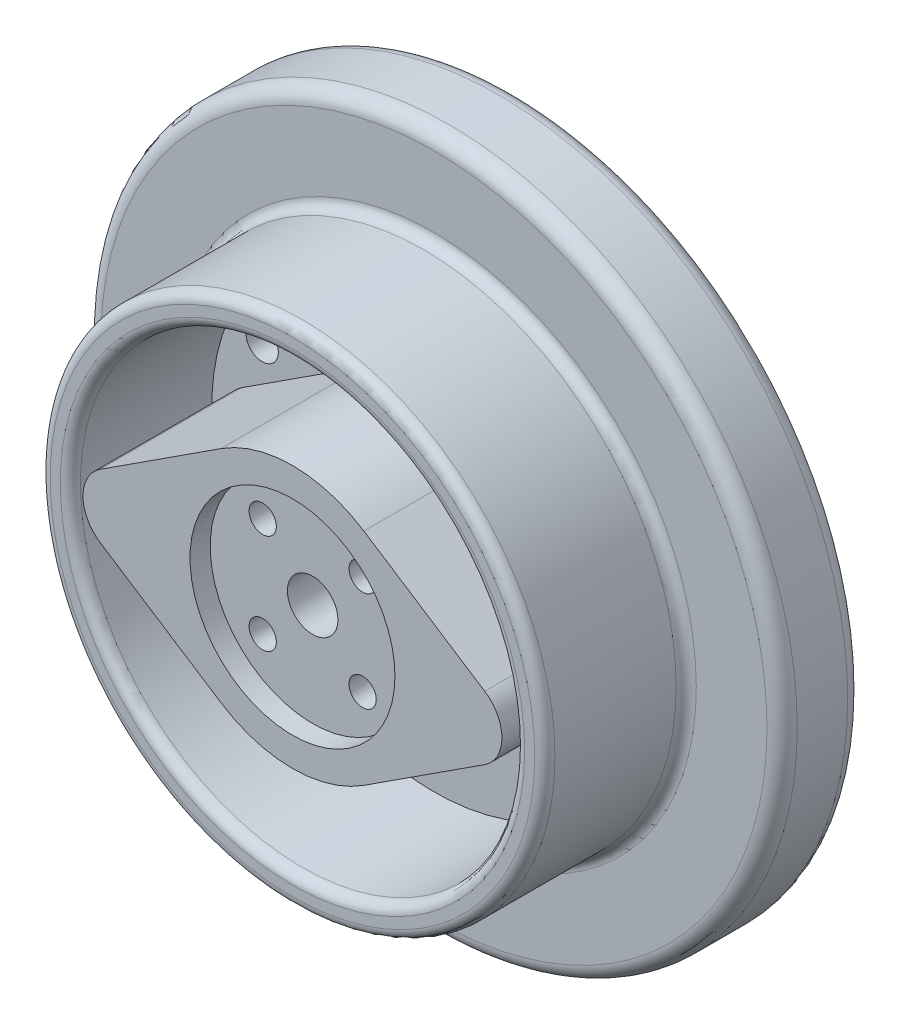
ISO-10303-21;
HEADER;
FILE_DESCRIPTION(('STEP AP214'),'2;1');
FILE_NAME('part.step','',(''),(''),'','','');
FILE_SCHEMA(('AUTOMOTIVE_DESIGN { 1 0 10303 214 1 1 1 1 }'));
ENDSEC;
DATA;
#1=APPLICATION_CONTEXT('core data for automotive mechanical design processes');
#2=APPLICATION_PROTOCOL_DEFINITION('international standard','automotive_design',2000,#1);
#3=PRODUCT_CONTEXT('',#1,'mechanical');
#4=PRODUCT('Part','Part','',(#3));
#5=PRODUCT_RELATED_PRODUCT_CATEGORY('part','',(#4));
#6=PRODUCT_DEFINITION_FORMATION('','',#4);
#7=PRODUCT_DEFINITION_CONTEXT('part definition',#1,'design');
#8=PRODUCT_DEFINITION('design','',#6,#7);
#9=PRODUCT_DEFINITION_SHAPE('','',#8);
#10=(LENGTH_UNIT() NAMED_UNIT(*) SI_UNIT(.MILLI.,.METRE.));
#11=(NAMED_UNIT(*) PLANE_ANGLE_UNIT() SI_UNIT($,.RADIAN.));
#12=(NAMED_UNIT(*) SI_UNIT($,.STERADIAN.) SOLID_ANGLE_UNIT());
#13=UNCERTAINTY_MEASURE_WITH_UNIT(LENGTH_MEASURE(1.E-05),#10,'distance_accuracy_value','');
#14=(GEOMETRIC_REPRESENTATION_CONTEXT(3) GLOBAL_UNCERTAINTY_ASSIGNED_CONTEXT((#13)) GLOBAL_UNIT_ASSIGNED_CONTEXT((#10,
#11,#12)) REPRESENTATION_CONTEXT('',''));
#15=CARTESIAN_POINT('',(0.,0.,0.));
#16=DIRECTION('',(0.,0.,1.));
#17=DIRECTION('',(1.,0.,0.));
#18=AXIS2_PLACEMENT_3D('',#15,#16,#17);
#19=CARTESIAN_POINT('',(17.,0.,0.));
#20=DIRECTION('',(0.,0.,1.));
#21=DIRECTION('',(1.,0.,0.));
#22=AXIS2_PLACEMENT_3D('',#19,#20,#21);
#23=CYLINDRICAL_SURFACE('',#22,2.55);
#24=CARTESIAN_POINT('',(17.,0.,0.));
#25=DIRECTION('',(0.,0.,1.));
#26=DIRECTION('',(1.,0.,0.));
#27=AXIS2_PLACEMENT_3D('',#24,#25,#26);
#28=CIRCLE('',#27,2.55);
#29=CARTESIAN_POINT('',(19.55,0.,0.));
#30=VERTEX_POINT('',#29);
#31=EDGE_CURVE('E189',#30,#30,#28,.T.);
#32=ORIENTED_EDGE('',*,*,#31,.F.);
#33=EDGE_LOOP('',(#32));
#34=FACE_BOUND('',#33,.T.);
#35=CARTESIAN_POINT('',(17.,0.,19.));
#36=DIRECTION('',(0.,0.,1.));
#37=DIRECTION('',(1.,0.,0.));
#38=AXIS2_PLACEMENT_3D('',#35,#36,#37);
#39=CIRCLE('',#38,2.55);
#40=CARTESIAN_POINT('',(19.55,0.,19.));
#41=VERTEX_POINT('',#40);
#42=EDGE_CURVE('E237',#41,#41,#39,.F.);
#43=ORIENTED_EDGE('',*,*,#42,.F.);
#44=EDGE_LOOP('',(#43));
#45=FACE_BOUND('',#44,.T.);
#46=ADVANCED_FACE('F40',(#34,#45),#23,.F.);
#47=CARTESIAN_POINT('',(-17.,0.,0.));
#48=DIRECTION('',(0.,0.,1.));
#49=DIRECTION('',(1.,0.,0.));
#50=AXIS2_PLACEMENT_3D('',#47,#48,#49);
#51=CYLINDRICAL_SURFACE('',#50,2.55);
#52=CARTESIAN_POINT('',(-17.,0.,0.));
#53=DIRECTION('',(0.,0.,1.));
#54=DIRECTION('',(1.,0.,0.));
#55=AXIS2_PLACEMENT_3D('',#52,#53,#54);
#56=CIRCLE('',#55,2.55);
#57=CARTESIAN_POINT('',(-14.45,0.,0.));
#58=VERTEX_POINT('',#57);
#59=EDGE_CURVE('E195',#58,#58,#56,.F.);
#60=ORIENTED_EDGE('',*,*,#59,.T.);
#61=EDGE_LOOP('',(#60));
#62=FACE_BOUND('',#61,.T.);
#63=CARTESIAN_POINT('',(-17.,0.,19.));
#64=DIRECTION('',(0.,0.,1.));
#65=DIRECTION('',(1.,0.,0.));
#66=AXIS2_PLACEMENT_3D('',#63,#64,#65);
#67=CIRCLE('',#66,2.55);
#68=CARTESIAN_POINT('',(-14.45,0.,19.));
#69=VERTEX_POINT('',#68);
#70=EDGE_CURVE('E278',#69,#69,#67,.T.);
#71=ORIENTED_EDGE('',*,*,#70,.T.);
#72=EDGE_LOOP('',(#71));
#73=FACE_BOUND('',#72,.T.);
#74=ADVANCED_FACE('F322',(#62,#73),#51,.F.);
#75=CARTESIAN_POINT('',(0.,0.,8.));
#76=DIRECTION('',(0.,0.,1.));
#77=DIRECTION('',(1.,0.,0.));
#78=AXIS2_PLACEMENT_3D('',#75,#76,#77);
#79=PLANE('',#78);
#80=CARTESIAN_POINT('',(0.,18.,8.));
#81=DIRECTION('',(0.,0.,1.));
#82=DIRECTION('',(1.,0.,0.));
#83=AXIS2_PLACEMENT_3D('',#80,#81,#82);
#84=CIRCLE('',#83,1.65);
#85=CARTESIAN_POINT('',(1.65,18.,8.));
#86=VERTEX_POINT('',#85);
#87=EDGE_CURVE('E274',#86,#86,#84,.T.);
#88=ORIENTED_EDGE('',*,*,#87,.F.);
#89=EDGE_LOOP('',(#88));
#90=FACE_BOUND('',#89,.T.);
#91=CARTESIAN_POINT('',(0.,-18.,8.));
#92=DIRECTION('',(0.,0.,1.));
#93=DIRECTION('',(1.,0.,0.));
#94=AXIS2_PLACEMENT_3D('',#91,#92,#93);
#95=CIRCLE('',#94,1.65);
#96=CARTESIAN_POINT('',(1.65,-18.,8.));
#97=VERTEX_POINT('',#96);
#98=EDGE_CURVE('E280',#97,#97,#95,.T.);
#99=ORIENTED_EDGE('',*,*,#98,.F.);
#100=EDGE_LOOP('',(#99));
#101=FACE_BOUND('',#100,.T.);
#102=CARTESIAN_POINT('',(-17.,-8.,8.));
#103=DIRECTION('',(0.,0.,1.));
#104=DIRECTION('',(1.,0.,0.));
#105=AXIS2_PLACEMENT_3D('',#102,#103,#104);
#106=CIRCLE('',#105,1.6);
#107=CARTESIAN_POINT('',(-15.4,-8.,8.));
#108=VERTEX_POINT('',#107);
#109=EDGE_CURVE('E202',#108,#108,#106,.F.);
#110=ORIENTED_EDGE('',*,*,#109,.T.);
#111=EDGE_LOOP('',(#110));
#112=FACE_BOUND('',#111,.T.);
#113=CARTESIAN_POINT('',(-17.,8.,8.));
#114=DIRECTION('',(0.,0.,1.));
#115=DIRECTION('',(1.,0.,0.));
#116=AXIS2_PLACEMENT_3D('',#113,#114,#115);
#117=CIRCLE('',#116,1.6);
#118=CARTESIAN_POINT('',(-15.4,8.,8.));
#119=VERTEX_POINT('',#118);
#120=EDGE_CURVE('E196',#119,#119,#117,.F.);
#121=ORIENTED_EDGE('',*,*,#120,.T.);
#122=EDGE_LOOP('',(#121));
#123=FACE_BOUND('',#122,.T.);
#124=CARTESIAN_POINT('',(0.,0.,8.));
#125=DIRECTION('',(0.,0.,1.));
#126=DIRECTION('',(1.,0.,0.));
#127=AXIS2_PLACEMENT_3D('',#124,#125,#126);
#128=CIRCLE('',#127,22.);
#129=CARTESIAN_POINT('',(22.,0.,8.));
#130=VERTEX_POINT('',#129);
#131=EDGE_CURVE('E222',#130,#130,#128,.F.);
#132=ORIENTED_EDGE('',*,*,#131,.F.);
#133=EDGE_LOOP('',(#132));
#134=FACE_BOUND('',#133,.T.);
#135=CARTESIAN_POINT('',(17.,8.,8.));
#136=DIRECTION('',(0.,0.,1.));
#137=DIRECTION('',(1.,0.,0.));
#138=AXIS2_PLACEMENT_3D('',#135,#136,#137);
#139=CIRCLE('',#138,1.6);
#140=CARTESIAN_POINT('',(18.6,8.,8.));
#141=VERTEX_POINT('',#140);
#142=EDGE_CURVE('E185',#141,#141,#139,.T.);
#143=ORIENTED_EDGE('',*,*,#142,.F.);
#144=EDGE_LOOP('',(#143));
#145=FACE_BOUND('',#144,.T.);
#146=CARTESIAN_POINT('',(17.,-8.,8.));
#147=DIRECTION('',(0.,0.,1.));
#148=DIRECTION('',(1.,0.,0.));
#149=AXIS2_PLACEMENT_3D('',#146,#147,#148);
#150=CIRCLE('',#149,1.6);
#151=CARTESIAN_POINT('',(18.6,-8.,8.));
#152=VERTEX_POINT('',#151);
#153=EDGE_CURVE('E208',#152,#152,#150,.T.);
#154=ORIENTED_EDGE('',*,*,#153,.F.);
#155=EDGE_LOOP('',(#154));
#156=FACE_BOUND('',#155,.T.);
#157=CARTESIAN_POINT('',(0.,0.,8.));
#158=DIRECTION('',(0.,0.,1.));
#159=DIRECTION('',(1.,0.,0.));
#160=AXIS2_PLACEMENT_3D('',#157,#158,#159);
#161=CIRCLE('',#160,13.);
#162=CARTESIAN_POINT('',(-7.07352941176471,-10.9071161019263,8.));
#163=VERTEX_POINT('',#162);
#164=CARTESIAN_POINT('',(7.07352941176471,-10.9071161019263,8.));
#165=VERTEX_POINT('',#164);
#166=EDGE_CURVE('E218',#163,#165,#161,.T.);
#167=ORIENTED_EDGE('',*,*,#166,.F.);
#168=DIRECTION('',(0.839008930917406,-0.544117647058824,0.));
#169=VECTOR('',#168,1.);
#170=CARTESIAN_POINT('',(-19.0404411764706,-3.14628349094027,8.));
#171=LINE('',#170,#169);
#172=CARTESIAN_POINT('',(-19.0404411764706,-3.14628349094027,8.));
#173=VERTEX_POINT('',#172);
#174=EDGE_CURVE('E120',#173,#163,#171,.T.);
#175=ORIENTED_EDGE('',*,*,#174,.F.);
#176=CARTESIAN_POINT('',(-17.,0.,8.));
#177=DIRECTION('',(0.,0.,1.));
#178=DIRECTION('',(-1.,0.,0.));
#179=AXIS2_PLACEMENT_3D('',#176,#177,#178);
#180=CIRCLE('',#179,3.75);
#181=CARTESIAN_POINT('',(-19.0404411764706,3.14628349094028,8.));
#182=VERTEX_POINT('',#181);
#183=EDGE_CURVE('E127',#182,#173,#180,.T.);
#184=ORIENTED_EDGE('',*,*,#183,.F.);
#185=DIRECTION('',(-0.839008930917406,-0.544117647058824,0.));
#186=VECTOR('',#185,1.);
#187=CARTESIAN_POINT('',(-7.07352941176471,10.9071161019263,8.));
#188=LINE('',#187,#186);
#189=CARTESIAN_POINT('',(-7.07352941176471,10.9071161019263,8.));
#190=VERTEX_POINT('',#189);
#191=EDGE_CURVE('E109',#190,#182,#188,.T.);
#192=ORIENTED_EDGE('',*,*,#191,.F.);
#193=CARTESIAN_POINT('',(7.07352941176471,10.9071161019263,8.));
#194=VERTEX_POINT('',#193);
#195=EDGE_CURVE('E224',#194,#190,#161,.T.);
#196=ORIENTED_EDGE('',*,*,#195,.F.);
#197=DIRECTION('',(-0.839008930917406,0.544117647058824,0.));
#198=VECTOR('',#197,1.);
#199=CARTESIAN_POINT('',(7.07352941176471,10.9071161019263,8.));
#200=LINE('',#199,#198);
#201=CARTESIAN_POINT('',(19.0404411764706,3.14628349094028,8.));
#202=VERTEX_POINT('',#201);
#203=EDGE_CURVE('E65',#202,#194,#200,.T.);
#204=ORIENTED_EDGE('',*,*,#203,.F.);
#205=CARTESIAN_POINT('',(17.,0.,8.));
#206=DIRECTION('',(0.,0.,1.));
#207=DIRECTION('',(1.,0.,0.));
#208=AXIS2_PLACEMENT_3D('',#205,#206,#207);
#209=CIRCLE('',#208,3.75);
#210=CARTESIAN_POINT('',(19.0404411764706,-3.14628349094028,8.));
#211=VERTEX_POINT('',#210);
#212=EDGE_CURVE('E136',#211,#202,#209,.T.);
#213=ORIENTED_EDGE('',*,*,#212,.F.);
#214=DIRECTION('',(0.839008930917406,0.544117647058824,0.));
#215=VECTOR('',#214,1.);
#216=CARTESIAN_POINT('',(19.0404411764706,-3.14628349094027,8.));
#217=LINE('',#216,#215);
#218=EDGE_CURVE('E134',#165,#211,#217,.T.);
#219=ORIENTED_EDGE('',*,*,#218,.F.);
#220=EDGE_LOOP('',(#167,#175,#184,#192,#196,#204,#213,#219));
#221=FACE_BOUND('',#220,.T.);
#222=ADVANCED_FACE('F133',(#90,#101,#112,#123,#134,#145,#156,#221),#79,.T.);
#223=CARTESIAN_POINT('',(0.,0.,22.));
#224=DIRECTION('',(0.,0.,-1.));
#225=DIRECTION('',(-1.,0.,0.));
#226=AXIS2_PLACEMENT_3D('',#223,#224,#225);
#227=CYLINDRICAL_SURFACE('',#226,13.);
#228=DIRECTION('',(0.,0.,-1.));
#229=VECTOR('',#228,1.);
#230=CARTESIAN_POINT('',(-7.07352941176471,10.9071161019263,22.));
#231=LINE('',#230,#229);
#232=CARTESIAN_POINT('',(-7.07352941176471,10.9071161019263,22.));
#233=VERTEX_POINT('',#232);
#234=EDGE_CURVE('E115',#233,#190,#231,.T.);
#235=ORIENTED_EDGE('',*,*,#234,.F.);
#236=CARTESIAN_POINT('',(0.,0.,22.));
#237=DIRECTION('',(0.,0.,1.));
#238=DIRECTION('',(1.,0.,0.));
#239=AXIS2_PLACEMENT_3D('',#236,#237,#238);
#240=CIRCLE('',#239,13.);
#241=CARTESIAN_POINT('',(7.07352941176471,10.9071161019263,22.));
#242=VERTEX_POINT('',#241);
#243=EDGE_CURVE('E219',#242,#233,#240,.T.);
#244=ORIENTED_EDGE('',*,*,#243,.F.);
#245=DIRECTION('',(0.,0.,-1.));
#246=VECTOR('',#245,1.);
#247=CARTESIAN_POINT('',(7.07352941176471,10.9071161019263,22.));
#248=LINE('',#247,#246);
#249=EDGE_CURVE('E149',#242,#194,#248,.T.);
#250=ORIENTED_EDGE('',*,*,#249,.T.);
#251=ORIENTED_EDGE('',*,*,#195,.T.);
#252=EDGE_LOOP('',(#235,#244,#250,#251));
#253=FACE_BOUND('',#252,.T.);
#254=ADVANCED_FACE('F347',(#253),#227,.T.);
#255=CARTESIAN_POINT('',(-7.07352941176471,-10.9071161019263,22.));
#256=VERTEX_POINT('',#255);
#257=CARTESIAN_POINT('',(7.07352941176471,-10.9071161019263,22.));
#258=VERTEX_POINT('',#257);
#259=EDGE_CURVE('E223',#256,#258,#240,.T.);
#260=ORIENTED_EDGE('',*,*,#259,.F.);
#261=DIRECTION('',(0.,0.,-1.));
#262=VECTOR('',#261,1.);
#263=CARTESIAN_POINT('',(-7.07352941176471,-10.9071161019263,22.));
#264=LINE('',#263,#262);
#265=EDGE_CURVE('E57',#256,#163,#264,.T.);
#266=ORIENTED_EDGE('',*,*,#265,.T.);
#267=ORIENTED_EDGE('',*,*,#166,.T.);
#268=DIRECTION('',(0.,0.,-1.));
#269=VECTOR('',#268,1.);
#270=CARTESIAN_POINT('',(7.07352941176471,-10.9071161019263,22.));
#271=LINE('',#270,#269);
#272=EDGE_CURVE('E159',#258,#165,#271,.T.);
#273=ORIENTED_EDGE('',*,*,#272,.F.);
#274=EDGE_LOOP('',(#260,#266,#267,#273));
#275=FACE_BOUND('',#274,.T.);
#276=ADVANCED_FACE('F294',(#275),#227,.T.);
#277=CARTESIAN_POINT('',(0.,0.,0.));
#278=DIRECTION('',(0.,0.,1.));
#279=DIRECTION('',(1.,0.,0.));
#280=AXIS2_PLACEMENT_3D('',#277,#278,#279);
#281=PLANE('',#280);
#282=CARTESIAN_POINT('',(0.,18.,0.));
#283=DIRECTION('',(0.,0.,1.));
#284=DIRECTION('',(1.,0.,0.));
#285=AXIS2_PLACEMENT_3D('',#282,#283,#284);
#286=CIRCLE('',#285,1.65);
#287=CARTESIAN_POINT('',(1.65,18.,0.));
#288=VERTEX_POINT('',#287);
#289=EDGE_CURVE('E44',#288,#288,#286,.T.);
#290=ORIENTED_EDGE('',*,*,#289,.T.);
#291=EDGE_LOOP('',(#290));
#292=FACE_BOUND('',#291,.T.);
#293=CARTESIAN_POINT('',(0.,-18.,0.));
#294=DIRECTION('',(0.,0.,1.));
#295=DIRECTION('',(1.,0.,0.));
#296=AXIS2_PLACEMENT_3D('',#293,#294,#295);
#297=CIRCLE('',#296,1.65);
#298=CARTESIAN_POINT('',(1.65,-18.,0.));
#299=VERTEX_POINT('',#298);
#300=EDGE_CURVE('E272',#299,#299,#297,.T.);
#301=ORIENTED_EDGE('',*,*,#300,.T.);
#302=EDGE_LOOP('',(#301));
#303=FACE_BOUND('',#302,.T.);
#304=CARTESIAN_POINT('',(0.,0.,0.));
#305=DIRECTION('',(0.,0.,1.));
#306=DIRECTION('',(1.,0.,0.));
#307=AXIS2_PLACEMENT_3D('',#304,#305,#306);
#308=CIRCLE('',#307,33.);
#309=CARTESIAN_POINT('',(33.,0.,0.));
#310=VERTEX_POINT('',#309);
#311=EDGE_CURVE('E12',#310,#310,#308,.F.);
#312=ORIENTED_EDGE('',*,*,#311,.T.);
#313=EDGE_LOOP('',(#312));
#314=FACE_BOUND('',#313,.T.);
#315=CARTESIAN_POINT('',(0.,0.,0.));
#316=DIRECTION('',(0.,0.,-1.));
#317=DIRECTION('',(-1.,0.,0.));
#318=AXIS2_PLACEMENT_3D('',#315,#316,#317);
#319=CIRCLE('',#318,10.5);
#320=CARTESIAN_POINT('',(-10.5,0.,0.));
#321=VERTEX_POINT('',#320);
#322=EDGE_CURVE('E178',#321,#321,#319,.T.);
#323=ORIENTED_EDGE('',*,*,#322,.F.);
#324=EDGE_LOOP('',(#323));
#325=FACE_BOUND('',#324,.T.);
#326=CARTESIAN_POINT('',(-17.,8.,0.));
#327=DIRECTION('',(0.,0.,1.));
#328=DIRECTION('',(1.,0.,0.));
#329=AXIS2_PLACEMENT_3D('',#326,#327,#328);
#330=CIRCLE('',#329,1.6);
#331=CARTESIAN_POINT('',(-15.4,8.,0.));
#332=VERTEX_POINT('',#331);
#333=EDGE_CURVE('E192',#332,#332,#330,.F.);
#334=ORIENTED_EDGE('',*,*,#333,.F.);
#335=EDGE_LOOP('',(#334));
#336=FACE_BOUND('',#335,.T.);
#337=CARTESIAN_POINT('',(-17.,-8.,0.));
#338=DIRECTION('',(0.,0.,1.));
#339=DIRECTION('',(1.,0.,0.));
#340=AXIS2_PLACEMENT_3D('',#337,#338,#339);
#341=CIRCLE('',#340,1.6);
#342=CARTESIAN_POINT('',(-15.4,-8.,0.));
#343=VERTEX_POINT('',#342);
#344=EDGE_CURVE('E199',#343,#343,#341,.F.);
#345=ORIENTED_EDGE('',*,*,#344,.F.);
#346=EDGE_LOOP('',(#345));
#347=FACE_BOUND('',#346,.T.);
#348=ORIENTED_EDGE('',*,*,#31,.T.);
#349=EDGE_LOOP('',(#348));
#350=FACE_BOUND('',#349,.T.);
#351=ORIENTED_EDGE('',*,*,#59,.F.);
#352=EDGE_LOOP('',(#351));
#353=FACE_BOUND('',#352,.T.);
#354=CARTESIAN_POINT('',(17.,8.,0.));
#355=DIRECTION('',(0.,0.,1.));
#356=DIRECTION('',(1.,0.,0.));
#357=AXIS2_PLACEMENT_3D('',#354,#355,#356);
#358=CIRCLE('',#357,1.6);
#359=CARTESIAN_POINT('',(18.6,8.,0.));
#360=VERTEX_POINT('',#359);
#361=EDGE_CURVE('E186',#360,#360,#358,.T.);
#362=ORIENTED_EDGE('',*,*,#361,.T.);
#363=EDGE_LOOP('',(#362));
#364=FACE_BOUND('',#363,.T.);
#365=CARTESIAN_POINT('',(17.,-8.,0.));
#366=DIRECTION('',(0.,0.,1.));
#367=DIRECTION('',(1.,0.,0.));
#368=AXIS2_PLACEMENT_3D('',#365,#366,#367);
#369=CIRCLE('',#368,1.6);
#370=CARTESIAN_POINT('',(18.6,-8.,0.));
#371=VERTEX_POINT('',#370);
#372=EDGE_CURVE('E205',#371,#371,#369,.T.);
#373=ORIENTED_EDGE('',*,*,#372,.T.);
#374=EDGE_LOOP('',(#373));
#375=FACE_BOUND('',#374,.T.);
#376=ADVANCED_FACE('F346',(#292,#303,#314,#325,#336,#347,#350,#353,#364,#375),#281,.F.);
#377=CARTESIAN_POINT('',(0.,0.,8.));
#378=DIRECTION('',(0.,0.,-1.));
#379=DIRECTION('',(-1.,0.,0.));
#380=AXIS2_PLACEMENT_3D('',#377,#378,#379);
#381=CYLINDRICAL_SURFACE('',#380,34.5);
#382=CARTESIAN_POINT('',(0.,0.,6.5));
#383=DIRECTION('',(0.,0.,1.));
#384=DIRECTION('',(1.,0.,0.));
#385=AXIS2_PLACEMENT_3D('',#382,#383,#384);
#386=CIRCLE('',#385,34.5);
#387=CARTESIAN_POINT('',(34.5,0.,6.5));
#388=VERTEX_POINT('',#387);
#389=EDGE_CURVE('E49',#388,#388,#386,.F.);
#390=ORIENTED_EDGE('',*,*,#389,.T.);
#391=EDGE_LOOP('',(#390));
#392=FACE_BOUND('',#391,.T.);
#393=CARTESIAN_POINT('',(0.,0.,1.5));
#394=DIRECTION('',(0.,0.,1.));
#395=DIRECTION('',(1.,0.,0.));
#396=AXIS2_PLACEMENT_3D('',#393,#394,#395);
#397=CIRCLE('',#396,34.5);
#398=CARTESIAN_POINT('',(34.5,0.,1.5));
#399=VERTEX_POINT('',#398);
#400=EDGE_CURVE('E268',#399,#399,#397,.T.);
#401=ORIENTED_EDGE('',*,*,#400,.T.);
#402=EDGE_LOOP('',(#401));
#403=FACE_BOUND('',#402,.T.);
#404=ADVANCED_FACE('F363',(#392,#403),#381,.T.);
#405=CARTESIAN_POINT('',(0.,0.,8.));
#406=DIRECTION('',(0.,0.,1.));
#407=DIRECTION('',(1.,0.,0.));
#408=AXIS2_PLACEMENT_3D('',#405,#406,#407);
#409=CIRCLE('',#408,33.);
#410=CARTESIAN_POINT('',(33.,0.,8.));
#411=VERTEX_POINT('',#410);
#412=EDGE_CURVE('E265',#411,#411,#409,.T.);
#413=ORIENTED_EDGE('',*,*,#412,.T.);
#414=EDGE_LOOP('',(#413));
#415=FACE_BOUND('',#414,.T.);
#416=CARTESIAN_POINT('',(0.,0.,8.));
#417=DIRECTION('',(0.,0.,1.));
#418=DIRECTION('',(1.,0.,0.));
#419=AXIS2_PLACEMENT_3D('',#416,#417,#418);
#420=CIRCLE('',#419,26.);
#421=CARTESIAN_POINT('',(26.,0.,8.));
#422=VERTEX_POINT('',#421);
#423=EDGE_CURVE('E231',#422,#422,#420,.F.);
#424=ORIENTED_EDGE('',*,*,#423,.T.);
#425=EDGE_LOOP('',(#424));
#426=FACE_BOUND('',#425,.T.);
#427=ADVANCED_FACE('F356',(#415,#426),#79,.T.);
#428=CARTESIAN_POINT('',(0.,0.,22.));
#429=DIRECTION('',(0.,0.,1.));
#430=DIRECTION('',(1.,0.,0.));
#431=AXIS2_PLACEMENT_3D('',#428,#429,#430);
#432=PLANE('',#431);
#433=CARTESIAN_POINT('',(0.,0.,22.));
#434=DIRECTION('',(0.,0.,1.));
#435=DIRECTION('',(1.,0.,0.));
#436=AXIS2_PLACEMENT_3D('',#433,#434,#435);
#437=CIRCLE('',#436,23.);
#438=CARTESIAN_POINT('',(23.,0.,22.));
#439=VERTEX_POINT('',#438);
#440=EDGE_CURVE('E259',#439,#439,#437,.F.);
#441=ORIENTED_EDGE('',*,*,#440,.T.);
#442=EDGE_LOOP('',(#441));
#443=FACE_BOUND('',#442,.T.);
#444=CARTESIAN_POINT('',(0.,0.,22.));
#445=DIRECTION('',(0.,0.,1.));
#446=DIRECTION('',(1.,0.,0.));
#447=AXIS2_PLACEMENT_3D('',#444,#445,#446);
#448=CIRCLE('',#447,24.);
#449=CARTESIAN_POINT('',(24.,0.,22.));
#450=VERTEX_POINT('',#449);
#451=EDGE_CURVE('E256',#450,#450,#448,.T.);
#452=ORIENTED_EDGE('',*,*,#451,.T.);
#453=EDGE_LOOP('',(#452));
#454=FACE_BOUND('',#453,.T.);
#455=ADVANCED_FACE('F353',(#443,#454),#432,.T.);
#456=CARTESIAN_POINT('',(0.,0.,22.));
#457=DIRECTION('',(0.,0.,-1.));
#458=DIRECTION('',(-1.,0.,0.));
#459=AXIS2_PLACEMENT_3D('',#456,#457,#458);
#460=CYLINDRICAL_SURFACE('',#459,25.);
#461=CARTESIAN_POINT('',(0.,0.,21.));
#462=DIRECTION('',(0.,0.,1.));
#463=DIRECTION('',(1.,0.,0.));
#464=AXIS2_PLACEMENT_3D('',#461,#462,#463);
#465=CIRCLE('',#464,25.);
#466=CARTESIAN_POINT('',(25.,0.,21.));
#467=VERTEX_POINT('',#466);
#468=EDGE_CURVE('E262',#467,#467,#465,.F.);
#469=ORIENTED_EDGE('',*,*,#468,.T.);
#470=EDGE_LOOP('',(#469));
#471=FACE_BOUND('',#470,.T.);
#472=CARTESIAN_POINT('',(0.,0.,9.));
#473=DIRECTION('',(0.,0.,1.));
#474=DIRECTION('',(1.,0.,0.));
#475=AXIS2_PLACEMENT_3D('',#472,#473,#474);
#476=CIRCLE('',#475,25.);
#477=CARTESIAN_POINT('',(25.,0.,9.));
#478=VERTEX_POINT('',#477);
#479=EDGE_CURVE('E228',#478,#478,#476,.T.);
#480=ORIENTED_EDGE('',*,*,#479,.T.);
#481=EDGE_LOOP('',(#480));
#482=FACE_BOUND('',#481,.T.);
#483=ADVANCED_FACE('F351',(#471,#482),#460,.T.);
#484=CARTESIAN_POINT('',(0.,0.,22.));
#485=DIRECTION('',(0.,0.,-1.));
#486=DIRECTION('',(-1.,0.,0.));
#487=AXIS2_PLACEMENT_3D('',#484,#485,#486);
#488=CYLINDRICAL_SURFACE('',#487,22.);
#489=CARTESIAN_POINT('',(0.,0.,21.));
#490=DIRECTION('',(0.,0.,1.));
#491=DIRECTION('',(1.,0.,0.));
#492=AXIS2_PLACEMENT_3D('',#489,#490,#491);
#493=CIRCLE('',#492,22.);
#494=CARTESIAN_POINT('',(22.,0.,21.));
#495=VERTEX_POINT('',#494);
#496=EDGE_CURVE('E253',#495,#495,#493,.T.);
#497=ORIENTED_EDGE('',*,*,#496,.T.);
#498=EDGE_LOOP('',(#497));
#499=FACE_BOUND('',#498,.T.);
#500=ORIENTED_EDGE('',*,*,#131,.T.);
#501=EDGE_LOOP('',(#500));
#502=FACE_BOUND('',#501,.T.);
#503=ADVANCED_FACE('F348',(#499,#502),#488,.F.);
#504=CARTESIAN_POINT('',(0.,0.,9.));
#505=DIRECTION('',(0.,0.,1.));
#506=DIRECTION('',(1.,0.,0.));
#507=AXIS2_PLACEMENT_3D('',#504,#505,#506);
#508=TOROIDAL_SURFACE('',#507,26.,1.);
#509=ORIENTED_EDGE('',*,*,#423,.F.);
#510=EDGE_LOOP('',(#509));
#511=FACE_BOUND('',#510,.T.);
#512=ORIENTED_EDGE('',*,*,#479,.F.);
#513=EDGE_LOOP('',(#512));
#514=FACE_BOUND('',#513,.T.);
#515=ADVANCED_FACE('F343',(#511,#514),#508,.F.);
#516=CARTESIAN_POINT('',(0.,0.,22.));
#517=DIRECTION('',(0.,0.,1.));
#518=DIRECTION('',(1.,0.,0.));
#519=AXIS2_PLACEMENT_3D('',#516,#517,#518);
#520=PLANE('',#519);
#521=ORIENTED_EDGE('',*,*,#243,.T.);
#522=DIRECTION('',(-0.839008930917406,-0.544117647058824,0.));
#523=VECTOR('',#522,1.);
#524=CARTESIAN_POINT('',(-7.07352941176471,10.9071161019263,22.));
#525=LINE('',#524,#523);
#526=CARTESIAN_POINT('',(-19.0404411764706,3.14628349094028,22.));
#527=VERTEX_POINT('',#526);
#528=EDGE_CURVE('E130',#233,#527,#525,.T.);
#529=ORIENTED_EDGE('',*,*,#528,.T.);
#530=CARTESIAN_POINT('',(-17.,0.,22.));
#531=DIRECTION('',(0.,0.,1.));
#532=DIRECTION('',(-1.,0.,0.));
#533=AXIS2_PLACEMENT_3D('',#530,#531,#532);
#534=CIRCLE('',#533,3.75);
#535=CARTESIAN_POINT('',(-19.0404411764706,-3.14628349094027,22.));
#536=VERTEX_POINT('',#535);
#537=EDGE_CURVE('E121',#527,#536,#534,.T.);
#538=ORIENTED_EDGE('',*,*,#537,.T.);
#539=DIRECTION('',(0.839008930917406,-0.544117647058824,0.));
#540=VECTOR('',#539,1.);
#541=CARTESIAN_POINT('',(-19.0404411764706,-3.14628349094027,22.));
#542=LINE('',#541,#540);
#543=EDGE_CURVE('E141',#536,#256,#542,.T.);
#544=ORIENTED_EDGE('',*,*,#543,.T.);
#545=ORIENTED_EDGE('',*,*,#259,.T.);
#546=DIRECTION('',(0.839008930917406,0.544117647058824,0.));
#547=VECTOR('',#546,1.);
#548=CARTESIAN_POINT('',(19.0404411764706,-3.14628349094027,22.));
#549=LINE('',#548,#547);
#550=CARTESIAN_POINT('',(19.0404411764706,-3.14628349094028,22.));
#551=VERTEX_POINT('',#550);
#552=EDGE_CURVE('E144',#258,#551,#549,.T.);
#553=ORIENTED_EDGE('',*,*,#552,.T.);
#554=CARTESIAN_POINT('',(17.,0.,22.));
#555=DIRECTION('',(0.,0.,1.));
#556=DIRECTION('',(1.,0.,0.));
#557=AXIS2_PLACEMENT_3D('',#554,#555,#556);
#558=CIRCLE('',#557,3.75);
#559=CARTESIAN_POINT('',(19.0404411764706,3.14628349094028,22.));
#560=VERTEX_POINT('',#559);
#561=EDGE_CURVE('E146',#551,#560,#558,.T.);
#562=ORIENTED_EDGE('',*,*,#561,.T.);
#563=DIRECTION('',(-0.839008930917406,0.544117647058824,0.));
#564=VECTOR('',#563,1.);
#565=CARTESIAN_POINT('',(7.07352941176471,10.9071161019263,22.));
#566=LINE('',#565,#564);
#567=EDGE_CURVE('E148',#560,#242,#566,.T.);
#568=ORIENTED_EDGE('',*,*,#567,.T.);
#569=EDGE_LOOP('',(#521,#529,#538,#544,#545,#553,#562,#568));
#570=FACE_BOUND('',#569,.T.);
#571=CARTESIAN_POINT('',(0.,0.,22.));
#572=DIRECTION('',(0.,0.,1.));
#573=DIRECTION('',(1.,0.,0.));
#574=AXIS2_PLACEMENT_3D('',#571,#572,#573);
#575=CIRCLE('',#574,10.15);
#576=CARTESIAN_POINT('',(10.15,0.,22.));
#577=VERTEX_POINT('',#576);
#578=EDGE_CURVE('E215',#577,#577,#575,.T.);
#579=ORIENTED_EDGE('',*,*,#578,.F.);
#580=EDGE_LOOP('',(#579));
#581=FACE_BOUND('',#580,.T.);
#582=ADVANCED_FACE('F308',(#570,#581),#520,.T.);
#583=CARTESIAN_POINT('',(0.,0.,22.));
#584=DIRECTION('',(0.,0.,-1.));
#585=DIRECTION('',(-1.,0.,0.));
#586=AXIS2_PLACEMENT_3D('',#583,#584,#585);
#587=CYLINDRICAL_SURFACE('',#586,10.15);
#588=CARTESIAN_POINT('',(0.,0.,20.));
#589=DIRECTION('',(0.,0.,1.));
#590=DIRECTION('',(1.,0.,0.));
#591=AXIS2_PLACEMENT_3D('',#588,#589,#590);
#592=CIRCLE('',#591,10.15);
#593=CARTESIAN_POINT('',(10.15,0.,20.));
#594=VERTEX_POINT('',#593);
#595=EDGE_CURVE('E234',#594,#594,#592,.T.);
#596=ORIENTED_EDGE('',*,*,#595,.F.);
#597=EDGE_LOOP('',(#596));
#598=FACE_BOUND('',#597,.T.);
#599=ORIENTED_EDGE('',*,*,#578,.T.);
#600=EDGE_LOOP('',(#599));
#601=FACE_BOUND('',#600,.T.);
#602=ADVANCED_FACE('F336',(#598,#601),#587,.F.);
#603=CARTESIAN_POINT('',(17.,8.,0.));
#604=DIRECTION('',(0.,0.,1.));
#605=DIRECTION('',(1.,0.,0.));
#606=AXIS2_PLACEMENT_3D('',#603,#604,#605);
#607=CYLINDRICAL_SURFACE('',#606,1.6);
#608=ORIENTED_EDGE('',*,*,#361,.F.);
#609=EDGE_LOOP('',(#608));
#610=FACE_BOUND('',#609,.T.);
#611=ORIENTED_EDGE('',*,*,#142,.T.);
#612=EDGE_LOOP('',(#611));
#613=FACE_BOUND('',#612,.T.);
#614=ADVANCED_FACE('F339',(#610,#613),#607,.F.);
#615=CARTESIAN_POINT('',(17.,-8.,0.));
#616=DIRECTION('',(0.,0.,1.));
#617=DIRECTION('',(1.,0.,0.));
#618=AXIS2_PLACEMENT_3D('',#615,#616,#617);
#619=CYLINDRICAL_SURFACE('',#618,1.6);
#620=ORIENTED_EDGE('',*,*,#372,.F.);
#621=EDGE_LOOP('',(#620));
#622=FACE_BOUND('',#621,.T.);
#623=ORIENTED_EDGE('',*,*,#153,.T.);
#624=EDGE_LOOP('',(#623));
#625=FACE_BOUND('',#624,.T.);
#626=ADVANCED_FACE('F333',(#622,#625),#619,.F.);
#627=CARTESIAN_POINT('',(-17.,8.,0.));
#628=DIRECTION('',(0.,0.,1.));
#629=DIRECTION('',(1.,0.,0.));
#630=AXIS2_PLACEMENT_3D('',#627,#628,#629);
#631=CYLINDRICAL_SURFACE('',#630,1.6);
#632=ORIENTED_EDGE('',*,*,#333,.T.);
#633=EDGE_LOOP('',(#632));
#634=FACE_BOUND('',#633,.T.);
#635=ORIENTED_EDGE('',*,*,#120,.F.);
#636=EDGE_LOOP('',(#635));
#637=FACE_BOUND('',#636,.T.);
#638=ADVANCED_FACE('F426',(#634,#637),#631,.F.);
#639=CARTESIAN_POINT('',(-17.,-8.,0.));
#640=DIRECTION('',(0.,0.,1.));
#641=DIRECTION('',(1.,0.,0.));
#642=AXIS2_PLACEMENT_3D('',#639,#640,#641);
#643=CYLINDRICAL_SURFACE('',#642,1.6);
#644=ORIENTED_EDGE('',*,*,#344,.T.);
#645=EDGE_LOOP('',(#644));
#646=FACE_BOUND('',#645,.T.);
#647=ORIENTED_EDGE('',*,*,#109,.F.);
#648=EDGE_LOOP('',(#647));
#649=FACE_BOUND('',#648,.T.);
#650=ADVANCED_FACE('F455',(#646,#649),#643,.F.);
#651=CARTESIAN_POINT('',(0.,0.,20.));
#652=DIRECTION('',(0.,0.,1.));
#653=DIRECTION('',(1.,0.,0.));
#654=AXIS2_PLACEMENT_3D('',#651,#652,#653);
#655=PLANE('',#654);
#656=CARTESIAN_POINT('',(0.,0.,20.));
#657=DIRECTION('',(0.,0.,1.));
#658=DIRECTION('',(1.,0.,0.));
#659=AXIS2_PLACEMENT_3D('',#656,#657,#658);
#660=CIRCLE('',#659,2.5);
#661=CARTESIAN_POINT('',(2.5,0.,20.));
#662=VERTEX_POINT('',#661);
#663=EDGE_CURVE('E166',#662,#662,#660,.T.);
#664=ORIENTED_EDGE('',*,*,#663,.F.);
#665=EDGE_LOOP('',(#664));
#666=FACE_BOUND('',#665,.T.);
#667=CARTESIAN_POINT('',(4.94974746830585,-4.94974746830581,20.));
#668=DIRECTION('',(0.,0.,1.));
#669=DIRECTION('',(-1.,0.,0.));
#670=AXIS2_PLACEMENT_3D('',#667,#668,#669);
#671=CIRCLE('',#670,1.35);
#672=CARTESIAN_POINT('',(3.59974746830585,-4.94974746830581,20.));
#673=VERTEX_POINT('',#672);
#674=EDGE_CURVE('E162',#673,#673,#671,.T.);
#675=ORIENTED_EDGE('',*,*,#674,.F.);
#676=EDGE_LOOP('',(#675));
#677=FACE_BOUND('',#676,.T.);
#678=CARTESIAN_POINT('',(-4.94974746830585,-4.94974746830581,20.));
#679=DIRECTION('',(0.,0.,1.));
#680=DIRECTION('',(1.,0.,0.));
#681=AXIS2_PLACEMENT_3D('',#678,#679,#680);
#682=CIRCLE('',#681,1.35);
#683=CARTESIAN_POINT('',(-3.59974746830585,-4.94974746830581,20.));
#684=VERTEX_POINT('',#683);
#685=EDGE_CURVE('E170',#684,#684,#682,.T.);
#686=ORIENTED_EDGE('',*,*,#685,.F.);
#687=EDGE_LOOP('',(#686));
#688=FACE_BOUND('',#687,.T.);
#689=CARTESIAN_POINT('',(-4.94974746830585,4.94974746830581,20.));
#690=DIRECTION('',(0.,0.,1.));
#691=DIRECTION('',(-1.,0.,0.));
#692=AXIS2_PLACEMENT_3D('',#689,#690,#691);
#693=CIRCLE('',#692,1.35);
#694=CARTESIAN_POINT('',(-6.29974746830585,4.94974746830581,20.));
#695=VERTEX_POINT('',#694);
#696=EDGE_CURVE('E167',#695,#695,#693,.T.);
#697=ORIENTED_EDGE('',*,*,#696,.F.);
#698=EDGE_LOOP('',(#697));
#699=FACE_BOUND('',#698,.T.);
#700=CARTESIAN_POINT('',(4.94974746830585,4.94974746830581,20.));
#701=DIRECTION('',(0.,0.,1.));
#702=DIRECTION('',(1.,0.,0.));
#703=AXIS2_PLACEMENT_3D('',#700,#701,#702);
#704=CIRCLE('',#703,1.35);
#705=CARTESIAN_POINT('',(6.29974746830585,4.94974746830581,20.));
#706=VERTEX_POINT('',#705);
#707=EDGE_CURVE('E163',#706,#706,#704,.T.);
#708=ORIENTED_EDGE('',*,*,#707,.F.);
#709=EDGE_LOOP('',(#708));
#710=FACE_BOUND('',#709,.T.);
#711=ORIENTED_EDGE('',*,*,#595,.T.);
#712=EDGE_LOOP('',(#711));
#713=FACE_BOUND('',#712,.T.);
#714=ADVANCED_FACE('F452',(#666,#677,#688,#699,#710,#713),#655,.T.);
#715=CARTESIAN_POINT('',(0.,0.,15.));
#716=DIRECTION('',(0.,0.,1.));
#717=DIRECTION('',(1.,0.,0.));
#718=AXIS2_PLACEMENT_3D('',#715,#716,#717);
#719=PLANE('',#718);
#720=CARTESIAN_POINT('',(4.94974746830585,-4.94974746830581,15.));
#721=DIRECTION('',(0.,0.,1.));
#722=DIRECTION('',(1.,0.,0.));
#723=AXIS2_PLACEMENT_3D('',#720,#721,#722);
#724=CIRCLE('',#723,1.35);
#725=CARTESIAN_POINT('',(6.29974746830585,-4.94974746830581,15.));
#726=VERTEX_POINT('',#725);
#727=EDGE_CURVE('E182',#726,#726,#724,.T.);
#728=ORIENTED_EDGE('',*,*,#727,.T.);
#729=EDGE_LOOP('',(#728));
#730=FACE_BOUND('',#729,.T.);
#731=CARTESIAN_POINT('',(-4.94974746830585,-4.94974746830581,15.));
#732=DIRECTION('',(0.,0.,1.));
#733=DIRECTION('',(1.,0.,0.));
#734=AXIS2_PLACEMENT_3D('',#731,#732,#733);
#735=CIRCLE('',#734,1.35);
#736=CARTESIAN_POINT('',(-3.59974746830585,-4.94974746830581,15.));
#737=VERTEX_POINT('',#736);
#738=EDGE_CURVE('E246',#737,#737,#735,.T.);
#739=ORIENTED_EDGE('',*,*,#738,.T.);
#740=EDGE_LOOP('',(#739));
#741=FACE_BOUND('',#740,.T.);
#742=CARTESIAN_POINT('',(-4.94974746830585,4.94974746830581,15.));
#743=DIRECTION('',(0.,0.,1.));
#744=DIRECTION('',(1.,0.,0.));
#745=AXIS2_PLACEMENT_3D('',#742,#743,#744);
#746=CIRCLE('',#745,1.35);
#747=CARTESIAN_POINT('',(-3.59974746830585,4.94974746830581,15.));
#748=VERTEX_POINT('',#747);
#749=EDGE_CURVE('E243',#748,#748,#746,.T.);
#750=ORIENTED_EDGE('',*,*,#749,.T.);
#751=EDGE_LOOP('',(#750));
#752=FACE_BOUND('',#751,.T.);
#753=CARTESIAN_POINT('',(4.94974746830585,4.94974746830581,15.));
#754=DIRECTION('',(0.,0.,1.));
#755=DIRECTION('',(1.,0.,0.));
#756=AXIS2_PLACEMENT_3D('',#753,#754,#755);
#757=CIRCLE('',#756,1.35);
#758=CARTESIAN_POINT('',(6.29974746830585,4.94974746830581,15.));
#759=VERTEX_POINT('',#758);
#760=EDGE_CURVE('E240',#759,#759,#757,.T.);
#761=ORIENTED_EDGE('',*,*,#760,.T.);
#762=EDGE_LOOP('',(#761));
#763=FACE_BOUND('',#762,.T.);
#764=CARTESIAN_POINT('',(0.,0.,15.));
#765=DIRECTION('',(0.,0.,1.));
#766=DIRECTION('',(1.,0.,0.));
#767=AXIS2_PLACEMENT_3D('',#764,#765,#766);
#768=CIRCLE('',#767,2.5);
#769=CARTESIAN_POINT('',(2.5,0.,15.));
#770=VERTEX_POINT('',#769);
#771=EDGE_CURVE('E177',#770,#770,#768,.T.);
#772=ORIENTED_EDGE('',*,*,#771,.T.);
#773=EDGE_LOOP('',(#772));
#774=FACE_BOUND('',#773,.T.);
#775=CARTESIAN_POINT('',(0.,0.,15.));
#776=DIRECTION('',(0.,0.,1.));
#777=DIRECTION('',(1.,0.,0.));
#778=AXIS2_PLACEMENT_3D('',#775,#776,#777);
#779=CIRCLE('',#778,10.5);
#780=CARTESIAN_POINT('',(-10.5,0.,15.));
#781=VERTEX_POINT('',#780);
#782=EDGE_CURVE('E181',#781,#781,#779,.F.);
#783=ORIENTED_EDGE('',*,*,#782,.T.);
#784=EDGE_LOOP('',(#783));
#785=FACE_BOUND('',#784,.T.);
#786=ADVANCED_FACE('F462',(#730,#741,#752,#763,#774,#785),#719,.F.);
#787=CARTESIAN_POINT('',(0.,0.,49.698484809835));
#788=DIRECTION('',(0.,0.,-1.));
#789=DIRECTION('',(-1.,0.,0.));
#790=AXIS2_PLACEMENT_3D('',#787,#788,#789);
#791=CYLINDRICAL_SURFACE('',#790,10.5);
#792=CARTESIAN_POINT('',(-10.5,0.,0.));
#793=CARTESIAN_POINT('',(-10.5,0.,0.156249999999999));
#794=CARTESIAN_POINT('',(-10.5,0.,0.312499999999998));
#795=CARTESIAN_POINT('',(-10.5,0.,0.624999999999998));
#796=CARTESIAN_POINT('',(-10.5,0.,0.78125));
#797=CARTESIAN_POINT('',(-10.5,0.,1.09375));
#798=CARTESIAN_POINT('',(-10.5,0.,1.25));
#799=CARTESIAN_POINT('',(-10.5,0.,1.5625));
#800=CARTESIAN_POINT('',(-10.5,0.,1.71875));
#801=CARTESIAN_POINT('',(-10.5,0.,2.03125));
#802=CARTESIAN_POINT('',(-10.5,0.,2.1875));
#803=CARTESIAN_POINT('',(-10.5,0.,2.5));
#804=CARTESIAN_POINT('',(-10.5,0.,2.65625));
#805=CARTESIAN_POINT('',(-10.5,0.,2.96875));
#806=CARTESIAN_POINT('',(-10.5,0.,3.125));
#807=CARTESIAN_POINT('',(-10.5,0.,3.4375));
#808=CARTESIAN_POINT('',(-10.5,0.,3.59375));
#809=CARTESIAN_POINT('',(-10.5,0.,3.90625));
#810=CARTESIAN_POINT('',(-10.5,0.,4.0625));
#811=CARTESIAN_POINT('',(-10.5,0.,4.375));
#812=CARTESIAN_POINT('',(-10.5,0.,4.53125));
#813=CARTESIAN_POINT('',(-10.5,0.,4.84375));
#814=CARTESIAN_POINT('',(-10.5,0.,5.));
#815=CARTESIAN_POINT('',(-10.5,0.,5.3125));
#816=CARTESIAN_POINT('',(-10.5,0.,5.46875));
#817=CARTESIAN_POINT('',(-10.5,0.,5.78125));
#818=CARTESIAN_POINT('',(-10.5,0.,5.9375));
#819=CARTESIAN_POINT('',(-10.5,0.,6.25));
#820=CARTESIAN_POINT('',(-10.5,0.,6.40625));
#821=CARTESIAN_POINT('',(-10.5,0.,6.71875));
#822=CARTESIAN_POINT('',(-10.5,0.,6.875));
#823=CARTESIAN_POINT('',(-10.5,0.,7.1875));
#824=CARTESIAN_POINT('',(-10.5,0.,7.34375));
#825=CARTESIAN_POINT('',(-10.5,0.,7.65625));
#826=CARTESIAN_POINT('',(-10.5,0.,7.8125));
#827=CARTESIAN_POINT('',(-10.5,0.,8.125));
#828=CARTESIAN_POINT('',(-10.5,0.,8.28125));
#829=CARTESIAN_POINT('',(-10.5,0.,8.59375));
#830=CARTESIAN_POINT('',(-10.5,0.,8.75));
#831=CARTESIAN_POINT('',(-10.5,0.,9.0625));
#832=CARTESIAN_POINT('',(-10.5,0.,9.21875));
#833=CARTESIAN_POINT('',(-10.5,0.,9.53125));
#834=CARTESIAN_POINT('',(-10.5,0.,9.6875));
#835=CARTESIAN_POINT('',(-10.5,0.,10.));
#836=CARTESIAN_POINT('',(-10.5,0.,10.15625));
#837=CARTESIAN_POINT('',(-10.5,0.,10.46875));
#838=CARTESIAN_POINT('',(-10.5,0.,10.625));
#839=CARTESIAN_POINT('',(-10.5,0.,10.9375));
#840=CARTESIAN_POINT('',(-10.5,0.,11.09375));
#841=CARTESIAN_POINT('',(-10.5,0.,11.40625));
#842=CARTESIAN_POINT('',(-10.5,0.,11.5625));
#843=CARTESIAN_POINT('',(-10.5,0.,11.875));
#844=CARTESIAN_POINT('',(-10.5,0.,12.03125));
#845=CARTESIAN_POINT('',(-10.5,0.,12.34375));
#846=CARTESIAN_POINT('',(-10.5,0.,12.5));
#847=CARTESIAN_POINT('',(-10.5,0.,12.8125));
#848=CARTESIAN_POINT('',(-10.5,0.,12.96875));
#849=CARTESIAN_POINT('',(-10.5,0.,13.28125));
#850=CARTESIAN_POINT('',(-10.5,0.,13.4375));
#851=CARTESIAN_POINT('',(-10.5,0.,13.75));
#852=CARTESIAN_POINT('',(-10.5,0.,13.90625));
#853=CARTESIAN_POINT('',(-10.5,0.,14.21875));
#854=CARTESIAN_POINT('',(-10.5,0.,14.375));
#855=CARTESIAN_POINT('',(-10.5,0.,14.6875));
#856=CARTESIAN_POINT('',(-10.5,0.,14.84375));
#857=CARTESIAN_POINT('',(-10.5,0.,15.));
#858=B_SPLINE_CURVE_WITH_KNOTS('',3,(#792,#793,#794,#795,#796,#797,#798,#799,#800,#801,#802,
#803,#804,#805,#806,#807,#808,#809,#810,#811,#812,#813,#814,#815,#816,#817,#818,#819,#820,#821,
#822,#823,#824,#825,#826,#827,#828,#829,#830,#831,#832,#833,#834,#835,#836,#837,#838,#839,#840,
#841,#842,#843,#844,#845,#846,#847,#848,#849,#850,#851,#852,#853,#854,#855,#856,#857),
.UNSPECIFIED.,.F.,.F.,(4,2,2,2,2,2,2,2,2,2,2,2,2,2,2,2,2,2,2,2,2,2,2,2,2,2,2,2,2,2,2,2,4),(0.,
0.468749999999997,0.937500000000001,1.40625,1.875,2.34375,2.8125,3.28125,3.75,4.21875,4.6875,
5.15625,5.625,6.09375,6.5625,7.03125,7.5,7.96875,8.4375,8.90625,9.375,9.84375,10.3125,10.78125,
11.25,11.71875,12.1875,12.65625,13.125,13.59375,14.0625,14.53125,15.),.UNSPECIFIED.);
#859=EDGE_CURVE('BSEAM469',#321,#781,#858,.T.);
#860=ORIENTED_EDGE('',*,*,#322,.T.);
#861=ORIENTED_EDGE('',*,*,#782,.F.);
#862=ORIENTED_EDGE('',*,*,#859,.T.);
#863=ORIENTED_EDGE('',*,*,#859,.F.);
#864=EDGE_LOOP('',(#860,#862,#861,#863));
#865=FACE_BOUND('',#864,.T.);
#866=ADVANCED_FACE('F469',(#865),#791,.F.);
#867=CARTESIAN_POINT('',(0.,0.,0.));
#868=DIRECTION('',(0.,0.,1.));
#869=DIRECTION('',(1.,0.,0.));
#870=AXIS2_PLACEMENT_3D('',#867,#868,#869);
#871=CYLINDRICAL_SURFACE('',#870,2.5);
#872=ORIENTED_EDGE('',*,*,#663,.T.);
#873=EDGE_LOOP('',(#872));
#874=FACE_BOUND('',#873,.T.);
#875=ORIENTED_EDGE('',*,*,#771,.F.);
#876=EDGE_LOOP('',(#875));
#877=FACE_BOUND('',#876,.T.);
#878=ADVANCED_FACE('F489',(#874,#877),#871,.F.);
#879=CARTESIAN_POINT('',(4.94974746830585,4.94974746830581,0.));
#880=DIRECTION('',(0.,0.,1.));
#881=DIRECTION('',(1.,0.,0.));
#882=AXIS2_PLACEMENT_3D('',#879,#880,#881);
#883=CYLINDRICAL_SURFACE('',#882,1.35);
#884=ORIENTED_EDGE('',*,*,#707,.T.);
#885=EDGE_LOOP('',(#884));
#886=FACE_BOUND('',#885,.T.);
#887=ORIENTED_EDGE('',*,*,#760,.F.);
#888=EDGE_LOOP('',(#887));
#889=FACE_BOUND('',#888,.T.);
#890=ADVANCED_FACE('F485',(#886,#889),#883,.F.);
#891=CARTESIAN_POINT('',(-4.94974746830585,4.94974746830581,0.));
#892=DIRECTION('',(0.,0.,1.));
#893=DIRECTION('',(1.,0.,0.));
#894=AXIS2_PLACEMENT_3D('',#891,#892,#893);
#895=CYLINDRICAL_SURFACE('',#894,1.35);
#896=ORIENTED_EDGE('',*,*,#696,.T.);
#897=EDGE_LOOP('',(#896));
#898=FACE_BOUND('',#897,.T.);
#899=ORIENTED_EDGE('',*,*,#749,.F.);
#900=EDGE_LOOP('',(#899));
#901=FACE_BOUND('',#900,.T.);
#902=ADVANCED_FACE('F488',(#898,#901),#895,.F.);
#903=CARTESIAN_POINT('',(-4.94974746830585,-4.94974746830581,0.));
#904=DIRECTION('',(0.,0.,1.));
#905=DIRECTION('',(1.,0.,0.));
#906=AXIS2_PLACEMENT_3D('',#903,#904,#905);
#907=CYLINDRICAL_SURFACE('',#906,1.35);
#908=ORIENTED_EDGE('',*,*,#685,.T.);
#909=EDGE_LOOP('',(#908));
#910=FACE_BOUND('',#909,.T.);
#911=ORIENTED_EDGE('',*,*,#738,.F.);
#912=EDGE_LOOP('',(#911));
#913=FACE_BOUND('',#912,.T.);
#914=ADVANCED_FACE('F509',(#910,#913),#907,.F.);
#915=CARTESIAN_POINT('',(4.94974746830585,-4.94974746830581,0.));
#916=DIRECTION('',(0.,0.,1.));
#917=DIRECTION('',(1.,0.,0.));
#918=AXIS2_PLACEMENT_3D('',#915,#916,#917);
#919=CYLINDRICAL_SURFACE('',#918,1.35);
#920=ORIENTED_EDGE('',*,*,#674,.T.);
#921=EDGE_LOOP('',(#920));
#922=FACE_BOUND('',#921,.T.);
#923=ORIENTED_EDGE('',*,*,#727,.F.);
#924=EDGE_LOOP('',(#923));
#925=FACE_BOUND('',#924,.T.);
#926=ADVANCED_FACE('F506',(#922,#925),#919,.F.);
#927=CARTESIAN_POINT('',(19.0404411764706,-3.14628349094027,22.));
#928=DIRECTION('',(-0.544117647058824,0.839008930917406,0.));
#929=DIRECTION('',(-0.839008930917406,-0.544117647058824,0.));
#930=AXIS2_PLACEMENT_3D('',#927,#928,#929);
#931=PLANE('',#930);
#932=ORIENTED_EDGE('',*,*,#218,.T.);
#933=DIRECTION('',(0.,0.,-1.));
#934=VECTOR('',#933,1.);
#935=CARTESIAN_POINT('',(19.0404411764706,-3.14628349094028,22.));
#936=LINE('',#935,#934);
#937=EDGE_CURVE('E156',#551,#211,#936,.T.);
#938=ORIENTED_EDGE('',*,*,#937,.F.);
#939=ORIENTED_EDGE('',*,*,#552,.F.);
#940=ORIENTED_EDGE('',*,*,#272,.T.);
#941=EDGE_LOOP('',(#932,#938,#939,#940));
#942=FACE_BOUND('',#941,.T.);
#943=ADVANCED_FACE('F300',(#942),#931,.F.);
#944=CARTESIAN_POINT('',(17.,0.,22.));
#945=DIRECTION('',(0.,0.,-1.));
#946=DIRECTION('',(-1.,0.,0.));
#947=AXIS2_PLACEMENT_3D('',#944,#945,#946);
#948=CYLINDRICAL_SURFACE('',#947,3.75);
#949=ORIENTED_EDGE('',*,*,#212,.T.);
#950=DIRECTION('',(0.,0.,-1.));
#951=VECTOR('',#950,1.);
#952=CARTESIAN_POINT('',(19.0404411764706,3.14628349094028,22.));
#953=LINE('',#952,#951);
#954=EDGE_CURVE('E154',#560,#202,#953,.T.);
#955=ORIENTED_EDGE('',*,*,#954,.F.);
#956=ORIENTED_EDGE('',*,*,#561,.F.);
#957=ORIENTED_EDGE('',*,*,#937,.T.);
#958=EDGE_LOOP('',(#949,#955,#956,#957));
#959=FACE_BOUND('',#958,.T.);
#960=ADVANCED_FACE('F304',(#959),#948,.T.);
#961=CARTESIAN_POINT('',(7.07352941176471,10.9071161019263,22.));
#962=DIRECTION('',(-0.544117647058824,-0.839008930917406,0.));
#963=DIRECTION('',(0.839008930917406,-0.544117647058824,0.));
#964=AXIS2_PLACEMENT_3D('',#961,#962,#963);
#965=PLANE('',#964);
#966=ORIENTED_EDGE('',*,*,#203,.T.);
#967=ORIENTED_EDGE('',*,*,#249,.F.);
#968=ORIENTED_EDGE('',*,*,#567,.F.);
#969=ORIENTED_EDGE('',*,*,#954,.T.);
#970=EDGE_LOOP('',(#966,#967,#968,#969));
#971=FACE_BOUND('',#970,.T.);
#972=ADVANCED_FACE('F319',(#971),#965,.F.);
#973=CARTESIAN_POINT('',(-17.,0.,22.));
#974=DIRECTION('',(0.,0.,-1.));
#975=DIRECTION('',(-1.,0.,0.));
#976=AXIS2_PLACEMENT_3D('',#973,#974,#975);
#977=CYLINDRICAL_SURFACE('',#976,3.75);
#978=ORIENTED_EDGE('',*,*,#183,.T.);
#979=DIRECTION('',(0.,0.,-1.));
#980=VECTOR('',#979,1.);
#981=CARTESIAN_POINT('',(-19.0404411764706,-3.14628349094027,22.));
#982=LINE('',#981,#980);
#983=EDGE_CURVE('E289',#536,#173,#982,.T.);
#984=ORIENTED_EDGE('',*,*,#983,.F.);
#985=ORIENTED_EDGE('',*,*,#537,.F.);
#986=DIRECTION('',(0.,0.,-1.));
#987=VECTOR('',#986,1.);
#988=CARTESIAN_POINT('',(-19.0404411764706,3.14628349094028,22.));
#989=LINE('',#988,#987);
#990=EDGE_CURVE('E112',#527,#182,#989,.T.);
#991=ORIENTED_EDGE('',*,*,#990,.T.);
#992=EDGE_LOOP('',(#978,#984,#985,#991));
#993=FACE_BOUND('',#992,.T.);
#994=ADVANCED_FACE('F125',(#993),#977,.T.);
#995=CARTESIAN_POINT('',(-19.0404411764706,-3.14628349094027,22.));
#996=DIRECTION('',(0.544117647058824,0.839008930917406,0.));
#997=DIRECTION('',(-0.839008930917406,0.544117647058824,0.));
#998=AXIS2_PLACEMENT_3D('',#995,#996,#997);
#999=PLANE('',#998);
#1000=ORIENTED_EDGE('',*,*,#174,.T.);
#1001=ORIENTED_EDGE('',*,*,#265,.F.);
#1002=ORIENTED_EDGE('',*,*,#543,.F.);
#1003=ORIENTED_EDGE('',*,*,#983,.T.);
#1004=EDGE_LOOP('',(#1000,#1001,#1002,#1003));
#1005=FACE_BOUND('',#1004,.T.);
#1006=ADVANCED_FACE('F310',(#1005),#999,.F.);
#1007=CARTESIAN_POINT('',(-7.07352941176471,10.9071161019263,22.));
#1008=DIRECTION('',(0.544117647058824,-0.839008930917406,0.));
#1009=DIRECTION('',(0.839008930917406,0.544117647058824,0.));
#1010=AXIS2_PLACEMENT_3D('',#1007,#1008,#1009);
#1011=PLANE('',#1010);
#1012=ORIENTED_EDGE('',*,*,#191,.T.);
#1013=ORIENTED_EDGE('',*,*,#990,.F.);
#1014=ORIENTED_EDGE('',*,*,#528,.F.);
#1015=ORIENTED_EDGE('',*,*,#234,.T.);
#1016=EDGE_LOOP('',(#1012,#1013,#1014,#1015));
#1017=FACE_BOUND('',#1016,.T.);
#1018=ADVANCED_FACE('F111',(#1017),#1011,.F.);
#1019=CARTESIAN_POINT('',(-17.,0.,19.));
#1020=DIRECTION('',(0.,0.,1.));
#1021=DIRECTION('',(1.,0.,0.));
#1022=AXIS2_PLACEMENT_3D('',#1019,#1020,#1021);
#1023=PLANE('',#1022);
#1024=ORIENTED_EDGE('',*,*,#70,.F.);
#1025=EDGE_LOOP('',(#1024));
#1026=FACE_BOUND('',#1025,.T.);
#1027=ADVANCED_FACE('F317',(#1026),#1023,.F.);
#1028=CARTESIAN_POINT('',(17.,0.,19.));
#1029=DIRECTION('',(0.,0.,1.));
#1030=DIRECTION('',(1.,0.,0.));
#1031=AXIS2_PLACEMENT_3D('',#1028,#1029,#1030);
#1032=PLANE('',#1031);
#1033=ORIENTED_EDGE('',*,*,#42,.T.);
#1034=EDGE_LOOP('',(#1033));
#1035=FACE_BOUND('',#1034,.T.);
#1036=ADVANCED_FACE('F378',(#1035),#1032,.F.);
#1037=CARTESIAN_POINT('',(0.,0.,21.));
#1038=DIRECTION('',(0.,0.,1.));
#1039=DIRECTION('',(1.,0.,0.));
#1040=AXIS2_PLACEMENT_3D('',#1037,#1038,#1039);
#1041=TOROIDAL_SURFACE('',#1040,23.,1.);
#1042=ORIENTED_EDGE('',*,*,#440,.F.);
#1043=EDGE_LOOP('',(#1042));
#1044=FACE_BOUND('',#1043,.T.);
#1045=ORIENTED_EDGE('',*,*,#496,.F.);
#1046=EDGE_LOOP('',(#1045));
#1047=FACE_BOUND('',#1046,.T.);
#1048=ADVANCED_FACE('F374',(#1044,#1047),#1041,.T.);
#1049=CARTESIAN_POINT('',(0.,0.,21.));
#1050=DIRECTION('',(0.,0.,1.));
#1051=DIRECTION('',(1.,0.,0.));
#1052=AXIS2_PLACEMENT_3D('',#1049,#1050,#1051);
#1053=TOROIDAL_SURFACE('',#1052,24.,1.);
#1054=ORIENTED_EDGE('',*,*,#468,.F.);
#1055=EDGE_LOOP('',(#1054));
#1056=FACE_BOUND('',#1055,.T.);
#1057=ORIENTED_EDGE('',*,*,#451,.F.);
#1058=EDGE_LOOP('',(#1057));
#1059=FACE_BOUND('',#1058,.T.);
#1060=ADVANCED_FACE('F377',(#1056,#1059),#1053,.T.);
#1061=CARTESIAN_POINT('',(0.,0.,6.5));
#1062=DIRECTION('',(0.,0.,1.));
#1063=DIRECTION('',(1.,0.,0.));
#1064=AXIS2_PLACEMENT_3D('',#1061,#1062,#1063);
#1065=TOROIDAL_SURFACE('',#1064,33.,1.5);
#1066=ORIENTED_EDGE('',*,*,#389,.F.);
#1067=EDGE_LOOP('',(#1066));
#1068=FACE_BOUND('',#1067,.T.);
#1069=ORIENTED_EDGE('',*,*,#412,.F.);
#1070=EDGE_LOOP('',(#1069));
#1071=FACE_BOUND('',#1070,.T.);
#1072=ADVANCED_FACE('F381',(#1068,#1071),#1065,.T.);
#1073=CARTESIAN_POINT('',(0.,0.,1.5));
#1074=DIRECTION('',(0.,0.,1.));
#1075=DIRECTION('',(1.,0.,0.));
#1076=AXIS2_PLACEMENT_3D('',#1073,#1074,#1075);
#1077=TOROIDAL_SURFACE('',#1076,33.,1.5);
#1078=ORIENTED_EDGE('',*,*,#311,.F.);
#1079=EDGE_LOOP('',(#1078));
#1080=FACE_BOUND('',#1079,.T.);
#1081=ORIENTED_EDGE('',*,*,#400,.F.);
#1082=EDGE_LOOP('',(#1081));
#1083=FACE_BOUND('',#1082,.T.);
#1084=ADVANCED_FACE('F42',(#1080,#1083),#1077,.T.);
#1085=CARTESIAN_POINT('',(0.,-18.,-2.));
#1086=DIRECTION('',(0.,0.,1.));
#1087=DIRECTION('',(1.,0.,0.));
#1088=AXIS2_PLACEMENT_3D('',#1085,#1086,#1087);
#1089=CYLINDRICAL_SURFACE('',#1088,1.65);
#1090=ORIENTED_EDGE('',*,*,#98,.T.);
#1091=EDGE_LOOP('',(#1090));
#1092=FACE_BOUND('',#1091,.T.);
#1093=ORIENTED_EDGE('',*,*,#300,.F.);
#1094=EDGE_LOOP('',(#1093));
#1095=FACE_BOUND('',#1094,.T.);
#1096=ADVANCED_FACE('F388',(#1092,#1095),#1089,.F.);
#1097=CARTESIAN_POINT('',(0.,18.,-2.));
#1098=DIRECTION('',(0.,0.,1.));
#1099=DIRECTION('',(1.,0.,0.));
#1100=AXIS2_PLACEMENT_3D('',#1097,#1098,#1099);
#1101=CYLINDRICAL_SURFACE('',#1100,1.65);
#1102=ORIENTED_EDGE('',*,*,#87,.T.);
#1103=EDGE_LOOP('',(#1102));
#1104=FACE_BOUND('',#1103,.T.);
#1105=ORIENTED_EDGE('',*,*,#289,.F.);
#1106=EDGE_LOOP('',(#1105));
#1107=FACE_BOUND('',#1106,.T.);
#1108=ADVANCED_FACE('F405',(#1104,#1107),#1101,.F.);
#1109=CLOSED_SHELL('',(#46,#74,#222,#254,#276,#376,#404,#427,#455,#483,#503,#515,#582,#602,#614,
#626,#638,#650,#714,#786,#866,#878,#890,#902,#914,#926,#943,#960,#972,#994,#1006,#1018,#1027,
#1036,#1048,#1060,#1072,#1084,#1096,#1108));
#1110=MANIFOLD_SOLID_BREP('B2',#1109);
#1111=ADVANCED_BREP_SHAPE_REPRESENTATION('',(#18,#1110),#14);
#1112=SHAPE_DEFINITION_REPRESENTATION(#9,#1111);
ENDSEC;
END-ISO-10303-21;
